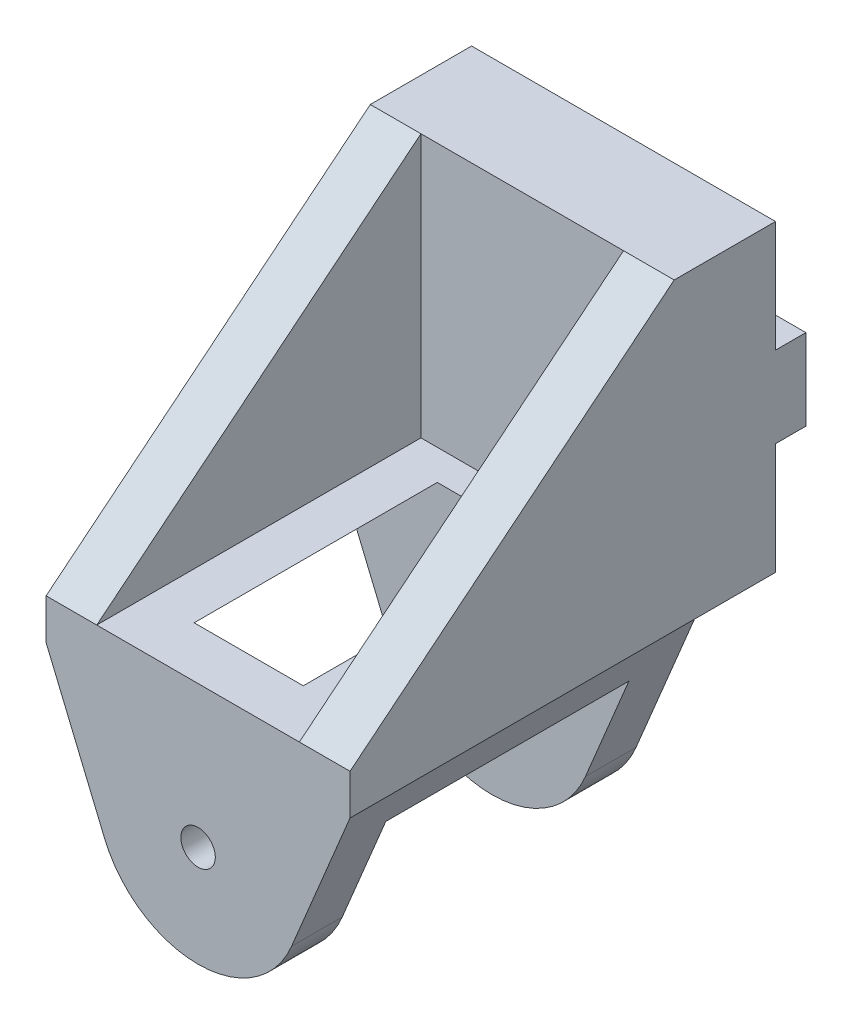
ISO-10303-21;
HEADER;
FILE_DESCRIPTION(('STEP AP214'),'2;1');
FILE_NAME('part.step','',(''),(''),'','','');
FILE_SCHEMA(('AUTOMOTIVE_DESIGN { 1 0 10303 214 1 1 1 1 }'));
ENDSEC;
DATA;
#1=APPLICATION_CONTEXT('core data for automotive mechanical design processes');
#2=APPLICATION_PROTOCOL_DEFINITION('international standard','automotive_design',2000,#1);
#3=PRODUCT_CONTEXT('',#1,'mechanical');
#4=PRODUCT('Part','Part','',(#3));
#5=PRODUCT_RELATED_PRODUCT_CATEGORY('part','',(#4));
#6=PRODUCT_DEFINITION_FORMATION('','',#4);
#7=PRODUCT_DEFINITION_CONTEXT('part definition',#1,'design');
#8=PRODUCT_DEFINITION('design','',#6,#7);
#9=PRODUCT_DEFINITION_SHAPE('','',#8);
#10=(LENGTH_UNIT() NAMED_UNIT(*) SI_UNIT(.MILLI.,.METRE.));
#11=(NAMED_UNIT(*) PLANE_ANGLE_UNIT() SI_UNIT($,.RADIAN.));
#12=(NAMED_UNIT(*) SI_UNIT($,.STERADIAN.) SOLID_ANGLE_UNIT());
#13=UNCERTAINTY_MEASURE_WITH_UNIT(LENGTH_MEASURE(1.E-05),#10,'distance_accuracy_value','');
#14=(GEOMETRIC_REPRESENTATION_CONTEXT(3) GLOBAL_UNCERTAINTY_ASSIGNED_CONTEXT((#13)) GLOBAL_UNIT_ASSIGNED_CONTEXT((#10,
#11,#12)) REPRESENTATION_CONTEXT('',''));
#15=CARTESIAN_POINT('',(0.,0.,0.));
#16=DIRECTION('',(0.,0.,1.));
#17=DIRECTION('',(1.,0.,0.));
#18=AXIS2_PLACEMENT_3D('',#15,#16,#17);
#19=CARTESIAN_POINT('',(15.,-10.,37.));
#20=DIRECTION('',(0.,0.,-1.));
#21=DIRECTION('',(-1.,0.,0.));
#22=AXIS2_PLACEMENT_3D('',#19,#20,#21);
#23=CYLINDRICAL_SURFACE('',#22,15.);
#24=CARTESIAN_POINT('',(15.,-10.,13.));
#25=DIRECTION('',(0.,0.,-1.));
#26=DIRECTION('',(-1.,0.,0.));
#27=AXIS2_PLACEMENT_3D('',#24,#25,#26);
#28=CIRCLE('',#27,15.);
#29=CARTESIAN_POINT('',(1.46910004326963,-3.52584010384713,13.));
#30=VERTEX_POINT('',#29);
#31=CARTESIAN_POINT('',(9.61483519286552,4.,13.));
#32=VERTEX_POINT('',#31);
#33=EDGE_CURVE('E312',#30,#32,#28,.T.);
#34=ORIENTED_EDGE('',*,*,#33,.T.);
#35=DIRECTION('',(0.,0.,-1.));
#36=VECTOR('',#35,1.);
#37=CARTESIAN_POINT('',(9.61483519286552,4.,37.));
#38=LINE('',#37,#36);
#39=CARTESIAN_POINT('',(9.61483519286552,4.,37.));
#40=VERTEX_POINT('',#39);
#41=EDGE_CURVE('E55',#32,#40,#38,.F.);
#42=ORIENTED_EDGE('',*,*,#41,.T.);
#43=CARTESIAN_POINT('',(15.,-10.,37.));
#44=DIRECTION('',(0.,0.,-1.));
#45=DIRECTION('',(-1.,0.,0.));
#46=AXIS2_PLACEMENT_3D('',#43,#44,#45);
#47=CIRCLE('',#46,15.);
#48=CARTESIAN_POINT('',(1.46910004326963,-3.52584010384713,37.));
#49=VERTEX_POINT('',#48);
#50=EDGE_CURVE('E304',#49,#40,#47,.T.);
#51=ORIENTED_EDGE('',*,*,#50,.F.);
#52=DIRECTION('',(0.,0.,-1.));
#53=VECTOR('',#52,1.);
#54=CARTESIAN_POINT('',(1.46910004326964,-3.52584010384713,37.));
#55=LINE('',#54,#53);
#56=EDGE_CURVE('E316',#30,#49,#55,.F.);
#57=ORIENTED_EDGE('',*,*,#56,.F.);
#58=EDGE_LOOP('',(#34,#42,#51,#57));
#59=FACE_BOUND('',#58,.T.);
#60=ADVANCED_FACE('F40',(#59),#23,.F.);
#61=CARTESIAN_POINT('',(15.,-10.,42.));
#62=DIRECTION('',(0.,0.,1.));
#63=DIRECTION('',(1.,0.,0.));
#64=AXIS2_PLACEMENT_3D('',#61,#62,#63);
#65=PLANE('',#64);
#66=DIRECTION('',(1.,0.,0.));
#67=VECTOR('',#66,1.);
#68=CARTESIAN_POINT('',(0.,4.,42.));
#69=LINE('',#68,#67);
#70=CARTESIAN_POINT('',(0.,4.,42.));
#71=VERTEX_POINT('',#70);
#72=CARTESIAN_POINT('',(5.,4.,42.));
#73=VERTEX_POINT('',#72);
#74=EDGE_CURVE('E209',#71,#73,#69,.T.);
#75=ORIENTED_EDGE('',*,*,#74,.F.);
#76=DIRECTION('',(0.,-1.,0.));
#77=VECTOR('',#76,1.);
#78=CARTESIAN_POINT('',(0.,0.,42.));
#79=LINE('',#78,#77);
#80=CARTESIAN_POINT('',(0.,0.,42.));
#81=VERTEX_POINT('',#80);
#82=EDGE_CURVE('E222',#71,#81,#79,.T.);
#83=ORIENTED_EDGE('',*,*,#82,.T.);
#84=DIRECTION('',(0.384615384615384,-0.923076923076923,0.));
#85=VECTOR('',#84,1.);
#86=CARTESIAN_POINT('',(0.,0.,42.));
#87=LINE('',#86,#85);
#88=CARTESIAN_POINT('',(5.76923076923077,-13.8461538461538,42.));
#89=VERTEX_POINT('',#88);
#90=EDGE_CURVE('E234',#81,#89,#87,.T.);
#91=ORIENTED_EDGE('',*,*,#90,.T.);
#92=CARTESIAN_POINT('',(15.,-10.,42.));
#93=DIRECTION('',(0.,0.,1.));
#94=DIRECTION('',(1.,0.,0.));
#95=AXIS2_PLACEMENT_3D('',#92,#93,#94);
#96=CIRCLE('',#95,10.);
#97=CARTESIAN_POINT('',(24.2307692307692,-13.8461538461539,42.));
#98=VERTEX_POINT('',#97);
#99=EDGE_CURVE('E237',#89,#98,#96,.T.);
#100=ORIENTED_EDGE('',*,*,#99,.T.);
#101=DIRECTION('',(0.384615384615384,0.923076923076923,0.));
#102=VECTOR('',#101,1.);
#103=CARTESIAN_POINT('',(30.,0.,42.));
#104=LINE('',#103,#102);
#105=CARTESIAN_POINT('',(30.,0.,42.));
#106=VERTEX_POINT('',#105);
#107=EDGE_CURVE('E245',#98,#106,#104,.T.);
#108=ORIENTED_EDGE('',*,*,#107,.T.);
#109=DIRECTION('',(0.,1.,0.));
#110=VECTOR('',#109,1.);
#111=CARTESIAN_POINT('',(30.,0.,42.));
#112=LINE('',#111,#110);
#113=CARTESIAN_POINT('',(30.,4.,42.));
#114=VERTEX_POINT('',#113);
#115=EDGE_CURVE('E235',#106,#114,#112,.T.);
#116=ORIENTED_EDGE('',*,*,#115,.T.);
#117=CARTESIAN_POINT('',(25.,4.,42.));
#118=VERTEX_POINT('',#117);
#119=EDGE_CURVE('E215',#118,#114,#69,.T.);
#120=ORIENTED_EDGE('',*,*,#119,.F.);
#121=DIRECTION('',(1.,0.,0.));
#122=VECTOR('',#121,1.);
#123=CARTESIAN_POINT('',(5.,4.,42.));
#124=LINE('',#123,#122);
#125=EDGE_CURVE('E226',#73,#118,#124,.T.);
#126=ORIENTED_EDGE('',*,*,#125,.F.);
#127=EDGE_LOOP('',(#75,#83,#91,#100,#108,#116,#120,#126));
#128=FACE_BOUND('',#127,.T.);
#129=CARTESIAN_POINT('',(15.,-10.,42.));
#130=DIRECTION('',(0.,0.,-1.));
#131=DIRECTION('',(-1.,0.,0.));
#132=AXIS2_PLACEMENT_3D('',#129,#130,#131);
#133=CIRCLE('',#132,1.7);
#134=CARTESIAN_POINT('',(13.3,-10.,42.));
#135=VERTEX_POINT('',#134);
#136=EDGE_CURVE('E371',#135,#135,#133,.T.);
#137=ORIENTED_EDGE('',*,*,#136,.T.);
#138=EDGE_LOOP('',(#137));
#139=FACE_BOUND('',#138,.T.);
#140=ADVANCED_FACE('F220',(#128,#139),#65,.T.);
#141=CARTESIAN_POINT('',(15.,-10.,0.));
#142=DIRECTION('',(0.,0.,1.));
#143=DIRECTION('',(1.,0.,0.));
#144=AXIS2_PLACEMENT_3D('',#141,#142,#143);
#145=PLANE('',#144);
#146=DIRECTION('',(1.,0.,0.));
#147=VECTOR('',#146,1.);
#148=CARTESIAN_POINT('',(0.,19.,0.));
#149=LINE('',#148,#147);
#150=CARTESIAN_POINT('',(0.,19.,0.));
#151=VERTEX_POINT('',#150);
#152=CARTESIAN_POINT('',(5.,19.,0.));
#153=VERTEX_POINT('',#152);
#154=EDGE_CURVE('E383',#151,#153,#149,.T.);
#155=ORIENTED_EDGE('',*,*,#154,.F.);
#156=DIRECTION('',(0.,-1.,0.));
#157=VECTOR('',#156,1.);
#158=CARTESIAN_POINT('',(0.,0.,0.));
#159=LINE('',#158,#157);
#160=CARTESIAN_POINT('',(0.,30.,0.));
#161=VERTEX_POINT('',#160);
#162=EDGE_CURVE('E240',#161,#151,#159,.T.);
#163=ORIENTED_EDGE('',*,*,#162,.F.);
#164=DIRECTION('',(-1.,0.,0.));
#165=VECTOR('',#164,1.);
#166=CARTESIAN_POINT('',(0.,30.,0.));
#167=LINE('',#166,#165);
#168=CARTESIAN_POINT('',(30.,30.,0.));
#169=VERTEX_POINT('',#168);
#170=EDGE_CURVE('E251',#169,#161,#167,.T.);
#171=ORIENTED_EDGE('',*,*,#170,.F.);
#172=DIRECTION('',(0.,1.,0.));
#173=VECTOR('',#172,1.);
#174=CARTESIAN_POINT('',(30.,0.,0.));
#175=LINE('',#174,#173);
#176=CARTESIAN_POINT('',(30.,19.,0.));
#177=VERTEX_POINT('',#176);
#178=EDGE_CURVE('E252',#177,#169,#175,.T.);
#179=ORIENTED_EDGE('',*,*,#178,.F.);
#180=DIRECTION('',(1.,0.,0.));
#181=VECTOR('',#180,1.);
#182=CARTESIAN_POINT('',(30.,19.,0.));
#183=LINE('',#182,#181);
#184=CARTESIAN_POINT('',(25.,19.,0.));
#185=VERTEX_POINT('',#184);
#186=EDGE_CURVE('E412',#185,#177,#183,.T.);
#187=ORIENTED_EDGE('',*,*,#186,.F.);
#188=DIRECTION('',(0.,1.,0.));
#189=VECTOR('',#188,1.);
#190=CARTESIAN_POINT('',(25.,19.,0.));
#191=LINE('',#190,#189);
#192=CARTESIAN_POINT('',(25.,11.,0.));
#193=VERTEX_POINT('',#192);
#194=EDGE_CURVE('E420',#193,#185,#191,.T.);
#195=ORIENTED_EDGE('',*,*,#194,.F.);
#196=DIRECTION('',(-1.,0.,0.));
#197=VECTOR('',#196,1.);
#198=CARTESIAN_POINT('',(30.,11.,0.));
#199=LINE('',#198,#197);
#200=CARTESIAN_POINT('',(30.,11.,0.));
#201=VERTEX_POINT('',#200);
#202=EDGE_CURVE('E407',#201,#193,#199,.T.);
#203=ORIENTED_EDGE('',*,*,#202,.F.);
#204=CARTESIAN_POINT('',(30.,0.,0.));
#205=VERTEX_POINT('',#204);
#206=EDGE_CURVE('E248',#205,#201,#175,.T.);
#207=ORIENTED_EDGE('',*,*,#206,.F.);
#208=DIRECTION('',(1.,0.,0.));
#209=VECTOR('',#208,1.);
#210=CARTESIAN_POINT('',(30.,0.,0.));
#211=LINE('',#210,#209);
#212=CARTESIAN_POINT('',(0.,0.,0.));
#213=VERTEX_POINT('',#212);
#214=EDGE_CURVE('E434',#213,#205,#211,.T.);
#215=ORIENTED_EDGE('',*,*,#214,.F.);
#216=CARTESIAN_POINT('',(0.,11.,0.));
#217=VERTEX_POINT('',#216);
#218=EDGE_CURVE('E255',#217,#213,#159,.T.);
#219=ORIENTED_EDGE('',*,*,#218,.F.);
#220=DIRECTION('',(-1.,0.,0.));
#221=VECTOR('',#220,1.);
#222=CARTESIAN_POINT('',(0.,11.,0.));
#223=LINE('',#222,#221);
#224=CARTESIAN_POINT('',(5.,11.,0.));
#225=VERTEX_POINT('',#224);
#226=EDGE_CURVE('E388',#225,#217,#223,.T.);
#227=ORIENTED_EDGE('',*,*,#226,.F.);
#228=DIRECTION('',(0.,-1.,0.));
#229=VECTOR('',#228,1.);
#230=CARTESIAN_POINT('',(5.,19.,0.));
#231=LINE('',#230,#229);
#232=EDGE_CURVE('E395',#153,#225,#231,.T.);
#233=ORIENTED_EDGE('',*,*,#232,.F.);
#234=EDGE_LOOP('',(#155,#163,#171,#179,#187,#195,#203,#207,#215,#219,#227,#233));
#235=FACE_BOUND('',#234,.T.);
#236=ADVANCED_FACE('F332',(#235),#145,.F.);
#237=CARTESIAN_POINT('',(0.,0.,42.));
#238=DIRECTION('',(0.923076923076923,0.384615384615384,0.));
#239=DIRECTION('',(-0.384615384615384,0.923076923076923,0.));
#240=AXIS2_PLACEMENT_3D('',#237,#238,#239);
#241=PLANE('',#240);
#242=DIRECTION('',(-0.384615384615384,0.923076923076923,0.));
#243=VECTOR('',#242,1.);
#244=CARTESIAN_POINT('',(0.,0.,8.));
#245=LINE('',#244,#243);
#246=CARTESIAN_POINT('',(5.76923076923077,-13.8461538461538,8.));
#247=VERTEX_POINT('',#246);
#248=CARTESIAN_POINT('',(0.,0.,8.));
#249=VERTEX_POINT('',#248);
#250=EDGE_CURVE('E284',#247,#249,#245,.T.);
#251=ORIENTED_EDGE('',*,*,#250,.F.);
#252=DIRECTION('',(0.,0.,-1.));
#253=VECTOR('',#252,1.);
#254=CARTESIAN_POINT('',(5.76923076923077,-13.8461538461538,42.));
#255=LINE('',#254,#253);
#256=CARTESIAN_POINT('',(5.76923076923077,-13.8461538461538,13.));
#257=VERTEX_POINT('',#256);
#258=EDGE_CURVE('E264',#257,#247,#255,.T.);
#259=ORIENTED_EDGE('',*,*,#258,.F.);
#260=DIRECTION('',(-0.384615384615384,0.923076923076923,0.));
#261=VECTOR('',#260,1.);
#262=CARTESIAN_POINT('',(0.,0.,13.));
#263=LINE('',#262,#261);
#264=EDGE_CURVE('E303',#257,#30,#263,.T.);
#265=ORIENTED_EDGE('',*,*,#264,.T.);
#266=ORIENTED_EDGE('',*,*,#56,.T.);
#267=DIRECTION('',(-0.384615384615384,0.923076923076923,0.));
#268=VECTOR('',#267,1.);
#269=CARTESIAN_POINT('',(0.,0.,37.));
#270=LINE('',#269,#268);
#271=CARTESIAN_POINT('',(5.76923076923077,-13.8461538461538,37.));
#272=VERTEX_POINT('',#271);
#273=EDGE_CURVE('E315',#272,#49,#270,.T.);
#274=ORIENTED_EDGE('',*,*,#273,.F.);
#275=EDGE_CURVE('E265',#89,#272,#255,.T.);
#276=ORIENTED_EDGE('',*,*,#275,.F.);
#277=ORIENTED_EDGE('',*,*,#90,.F.);
#278=DIRECTION('',(0.,0.,-1.));
#279=VECTOR('',#278,1.);
#280=CARTESIAN_POINT('',(0.,0.,42.));
#281=LINE('',#280,#279);
#282=EDGE_CURVE('E232',#81,#249,#281,.T.);
#283=ORIENTED_EDGE('',*,*,#282,.T.);
#284=EDGE_LOOP('',(#251,#259,#265,#266,#274,#276,#277,#283));
#285=FACE_BOUND('',#284,.T.);
#286=ADVANCED_FACE('F294',(#285),#241,.F.);
#287=CARTESIAN_POINT('',(30.,0.,42.));
#288=DIRECTION('',(-0.923076923076923,0.384615384615384,0.));
#289=DIRECTION('',(-0.384615384615384,-0.923076923076923,0.));
#290=AXIS2_PLACEMENT_3D('',#287,#288,#289);
#291=PLANE('',#290);
#292=DIRECTION('',(-0.384615384615384,-0.923076923076923,0.));
#293=VECTOR('',#292,1.);
#294=CARTESIAN_POINT('',(30.,0.,8.));
#295=LINE('',#294,#293);
#296=CARTESIAN_POINT('',(30.,0.,8.));
#297=VERTEX_POINT('',#296);
#298=CARTESIAN_POINT('',(24.2307692307692,-13.8461538461539,8.));
#299=VERTEX_POINT('',#298);
#300=EDGE_CURVE('E287',#297,#299,#295,.T.);
#301=ORIENTED_EDGE('',*,*,#300,.F.);
#302=DIRECTION('',(0.,0.,-1.));
#303=VECTOR('',#302,1.);
#304=CARTESIAN_POINT('',(30.,0.,42.));
#305=LINE('',#304,#303);
#306=EDGE_CURVE('E247',#106,#297,#305,.T.);
#307=ORIENTED_EDGE('',*,*,#306,.F.);
#308=ORIENTED_EDGE('',*,*,#107,.F.);
#309=DIRECTION('',(0.,0.,-1.));
#310=VECTOR('',#309,1.);
#311=CARTESIAN_POINT('',(24.2307692307692,-13.8461538461539,42.));
#312=LINE('',#311,#310);
#313=CARTESIAN_POINT('',(24.2307692307692,-13.8461538461539,37.));
#314=VERTEX_POINT('',#313);
#315=EDGE_CURVE('E261',#98,#314,#312,.T.);
#316=ORIENTED_EDGE('',*,*,#315,.T.);
#317=DIRECTION('',(-0.384615384615384,-0.923076923076923,0.));
#318=VECTOR('',#317,1.);
#319=CARTESIAN_POINT('',(30.,0.,37.));
#320=LINE('',#319,#318);
#321=CARTESIAN_POINT('',(28.5308999567304,-3.52584010384713,37.));
#322=VERTEX_POINT('',#321);
#323=EDGE_CURVE('E279',#322,#314,#320,.T.);
#324=ORIENTED_EDGE('',*,*,#323,.F.);
#325=DIRECTION('',(0.,0.,-1.));
#326=VECTOR('',#325,1.);
#327=CARTESIAN_POINT('',(28.5308999567304,-3.52584010384713,37.));
#328=LINE('',#327,#326);
#329=CARTESIAN_POINT('',(28.5308999567304,-3.52584010384713,13.));
#330=VERTEX_POINT('',#329);
#331=EDGE_CURVE('E276',#322,#330,#328,.T.);
#332=ORIENTED_EDGE('',*,*,#331,.T.);
#333=DIRECTION('',(-0.384615384615384,-0.923076923076923,0.));
#334=VECTOR('',#333,1.);
#335=CARTESIAN_POINT('',(30.,0.,13.));
#336=LINE('',#335,#334);
#337=CARTESIAN_POINT('',(24.2307692307692,-13.8461538461539,13.));
#338=VERTEX_POINT('',#337);
#339=EDGE_CURVE('E273',#330,#338,#336,.T.);
#340=ORIENTED_EDGE('',*,*,#339,.T.);
#341=EDGE_CURVE('E260',#338,#299,#312,.T.);
#342=ORIENTED_EDGE('',*,*,#341,.T.);
#343=EDGE_LOOP('',(#301,#307,#308,#316,#324,#332,#340,#342));
#344=FACE_BOUND('',#343,.T.);
#345=ADVANCED_FACE('F500',(#344),#291,.F.);
#346=CARTESIAN_POINT('',(15.,-10.,42.));
#347=DIRECTION('',(0.,0.,-1.));
#348=DIRECTION('',(-1.,0.,0.));
#349=AXIS2_PLACEMENT_3D('',#346,#347,#348);
#350=CYLINDRICAL_SURFACE('',#349,10.);
#351=CARTESIAN_POINT('',(15.,-10.,8.));
#352=DIRECTION('',(0.,0.,-1.));
#353=DIRECTION('',(-1.,0.,0.));
#354=AXIS2_PLACEMENT_3D('',#351,#352,#353);
#355=CIRCLE('',#354,10.);
#356=EDGE_CURVE('E48',#299,#247,#355,.T.);
#357=ORIENTED_EDGE('',*,*,#356,.F.);
#358=ORIENTED_EDGE('',*,*,#341,.F.);
#359=CARTESIAN_POINT('',(15.,-10.,13.));
#360=DIRECTION('',(0.,0.,-1.));
#361=DIRECTION('',(-1.,0.,0.));
#362=AXIS2_PLACEMENT_3D('',#359,#360,#361);
#363=CIRCLE('',#362,10.);
#364=EDGE_CURVE('E300',#338,#257,#363,.T.);
#365=ORIENTED_EDGE('',*,*,#364,.T.);
#366=ORIENTED_EDGE('',*,*,#258,.T.);
#367=EDGE_LOOP('',(#357,#358,#365,#366));
#368=FACE_BOUND('',#367,.T.);
#369=ADVANCED_FACE('F299',(#368),#350,.T.);
#370=CARTESIAN_POINT('',(15.,-10.,37.));
#371=DIRECTION('',(0.,0.,-1.));
#372=DIRECTION('',(-1.,0.,0.));
#373=AXIS2_PLACEMENT_3D('',#370,#371,#372);
#374=CIRCLE('',#373,10.);
#375=EDGE_CURVE('E306',#314,#272,#374,.T.);
#376=ORIENTED_EDGE('',*,*,#375,.F.);
#377=ORIENTED_EDGE('',*,*,#315,.F.);
#378=ORIENTED_EDGE('',*,*,#99,.F.);
#379=ORIENTED_EDGE('',*,*,#275,.T.);
#380=EDGE_LOOP('',(#376,#377,#378,#379));
#381=FACE_BOUND('',#380,.T.);
#382=ADVANCED_FACE('F506',(#381),#350,.T.);
#383=CARTESIAN_POINT('',(30.,0.,42.));
#384=DIRECTION('',(-1.,0.,0.));
#385=DIRECTION('',(0.,0.,1.));
#386=AXIS2_PLACEMENT_3D('',#383,#384,#385);
#387=PLANE('',#386);
#388=DIRECTION('',(0.,0.,-1.));
#389=VECTOR('',#388,1.);
#390=CARTESIAN_POINT('',(30.,30.,42.));
#391=LINE('',#390,#389);
#392=CARTESIAN_POINT('',(30.,30.,10.));
#393=VERTEX_POINT('',#392);
#394=EDGE_CURVE('E271',#393,#169,#391,.T.);
#395=ORIENTED_EDGE('',*,*,#394,.F.);
#396=DIRECTION('',(0.,0.630592625094466,-0.776114000116266));
#397=VECTOR('',#396,1.);
#398=CARTESIAN_POINT('',(30.,30.,10.));
#399=LINE('',#398,#397);
#400=EDGE_CURVE('E216',#114,#393,#399,.T.);
#401=ORIENTED_EDGE('',*,*,#400,.F.);
#402=ORIENTED_EDGE('',*,*,#115,.F.);
#403=ORIENTED_EDGE('',*,*,#306,.T.);
#404=DIRECTION('',(0.,0.,-1.));
#405=VECTOR('',#404,1.);
#406=CARTESIAN_POINT('',(30.,0.,49.0555127546399));
#407=LINE('',#406,#405);
#408=EDGE_CURVE('E437',#297,#205,#407,.T.);
#409=ORIENTED_EDGE('',*,*,#408,.T.);
#410=ORIENTED_EDGE('',*,*,#206,.T.);
#411=DIRECTION('',(0.,0.,1.));
#412=VECTOR('',#411,1.);
#413=CARTESIAN_POINT('',(30.,11.,-3.));
#414=LINE('',#413,#412);
#415=CARTESIAN_POINT('',(30.,11.,-3.));
#416=VERTEX_POINT('',#415);
#417=EDGE_CURVE('E431',#416,#201,#414,.T.);
#418=ORIENTED_EDGE('',*,*,#417,.F.);
#419=DIRECTION('',(0.,-1.,0.));
#420=VECTOR('',#419,1.);
#421=CARTESIAN_POINT('',(30.,19.,-3.));
#422=LINE('',#421,#420);
#423=CARTESIAN_POINT('',(30.,19.,-3.));
#424=VERTEX_POINT('',#423);
#425=EDGE_CURVE('E408',#424,#416,#422,.T.);
#426=ORIENTED_EDGE('',*,*,#425,.F.);
#427=DIRECTION('',(0.,0.,1.));
#428=VECTOR('',#427,1.);
#429=CARTESIAN_POINT('',(30.,19.,-3.));
#430=LINE('',#429,#428);
#431=EDGE_CURVE('E327',#424,#177,#430,.T.);
#432=ORIENTED_EDGE('',*,*,#431,.T.);
#433=ORIENTED_EDGE('',*,*,#178,.T.);
#434=EDGE_LOOP('',(#395,#401,#402,#403,#409,#410,#418,#426,#432,#433));
#435=FACE_BOUND('',#434,.T.);
#436=ADVANCED_FACE('F42',(#435),#387,.F.);
#437=CARTESIAN_POINT('',(0.,30.,42.));
#438=DIRECTION('',(0.,-1.,0.));
#439=DIRECTION('',(0.,0.,-1.));
#440=AXIS2_PLACEMENT_3D('',#437,#438,#439);
#441=PLANE('',#440);
#442=DIRECTION('',(0.,0.,-1.));
#443=VECTOR('',#442,1.);
#444=CARTESIAN_POINT('',(0.,30.,42.));
#445=LINE('',#444,#443);
#446=CARTESIAN_POINT('',(0.,30.,10.));
#447=VERTEX_POINT('',#446);
#448=EDGE_CURVE('E269',#447,#161,#445,.T.);
#449=ORIENTED_EDGE('',*,*,#448,.F.);
#450=DIRECTION('',(1.,0.,0.));
#451=VECTOR('',#450,1.);
#452=CARTESIAN_POINT('',(0.,30.,10.));
#453=LINE('',#452,#451);
#454=CARTESIAN_POINT('',(5.,30.,10.));
#455=VERTEX_POINT('',#454);
#456=EDGE_CURVE('E212',#447,#455,#453,.T.);
#457=ORIENTED_EDGE('',*,*,#456,.T.);
#458=DIRECTION('',(-1.,0.,0.));
#459=VECTOR('',#458,1.);
#460=CARTESIAN_POINT('',(5.,30.,10.));
#461=LINE('',#460,#459);
#462=CARTESIAN_POINT('',(25.,30.,10.));
#463=VERTEX_POINT('',#462);
#464=EDGE_CURVE('E338',#463,#455,#461,.T.);
#465=ORIENTED_EDGE('',*,*,#464,.F.);
#466=EDGE_CURVE('E227',#463,#393,#453,.T.);
#467=ORIENTED_EDGE('',*,*,#466,.T.);
#468=ORIENTED_EDGE('',*,*,#394,.T.);
#469=ORIENTED_EDGE('',*,*,#170,.T.);
#470=EDGE_LOOP('',(#449,#457,#465,#467,#468,#469));
#471=FACE_BOUND('',#470,.T.);
#472=ADVANCED_FACE('F334',(#471),#441,.F.);
#473=CARTESIAN_POINT('',(0.,0.,42.));
#474=DIRECTION('',(1.,0.,0.));
#475=DIRECTION('',(0.,0.,-1.));
#476=AXIS2_PLACEMENT_3D('',#473,#474,#475);
#477=PLANE('',#476);
#478=ORIENTED_EDGE('',*,*,#82,.F.);
#479=DIRECTION('',(0.,0.630592625094466,-0.776114000116266));
#480=VECTOR('',#479,1.);
#481=CARTESIAN_POINT('',(0.,30.,10.));
#482=LINE('',#481,#480);
#483=EDGE_CURVE('E206',#71,#447,#482,.T.);
#484=ORIENTED_EDGE('',*,*,#483,.T.);
#485=ORIENTED_EDGE('',*,*,#448,.T.);
#486=ORIENTED_EDGE('',*,*,#162,.T.);
#487=DIRECTION('',(0.,0.,1.));
#488=VECTOR('',#487,1.);
#489=CARTESIAN_POINT('',(0.,19.,-3.));
#490=LINE('',#489,#488);
#491=CARTESIAN_POINT('',(0.,19.,-3.));
#492=VERTEX_POINT('',#491);
#493=EDGE_CURVE('E405',#492,#151,#490,.T.);
#494=ORIENTED_EDGE('',*,*,#493,.F.);
#495=DIRECTION('',(0.,1.,0.));
#496=VECTOR('',#495,1.);
#497=CARTESIAN_POINT('',(0.,19.,-3.));
#498=LINE('',#497,#496);
#499=CARTESIAN_POINT('',(0.,11.,-3.));
#500=VERTEX_POINT('',#499);
#501=EDGE_CURVE('E384',#500,#492,#498,.T.);
#502=ORIENTED_EDGE('',*,*,#501,.F.);
#503=DIRECTION('',(0.,0.,1.));
#504=VECTOR('',#503,1.);
#505=CARTESIAN_POINT('',(0.,11.,-3.));
#506=LINE('',#505,#504);
#507=EDGE_CURVE('E62',#500,#217,#506,.T.);
#508=ORIENTED_EDGE('',*,*,#507,.T.);
#509=ORIENTED_EDGE('',*,*,#218,.T.);
#510=DIRECTION('',(0.,0.,-1.));
#511=VECTOR('',#510,1.);
#512=CARTESIAN_POINT('',(0.,0.,49.0555127546399));
#513=LINE('',#512,#511);
#514=EDGE_CURVE('E439',#249,#213,#513,.T.);
#515=ORIENTED_EDGE('',*,*,#514,.F.);
#516=ORIENTED_EDGE('',*,*,#282,.F.);
#517=EDGE_LOOP('',(#478,#484,#485,#486,#494,#502,#508,#509,#515,#516));
#518=FACE_BOUND('',#517,.T.);
#519=ADVANCED_FACE('F229',(#518),#477,.F.);
#520=CARTESIAN_POINT('',(20.3851648071345,4.,37.));
#521=VERTEX_POINT('',#520);
#522=EDGE_CURVE('E309',#521,#322,#47,.T.);
#523=ORIENTED_EDGE('',*,*,#522,.F.);
#524=DIRECTION('',(0.,0.,-1.));
#525=VECTOR('',#524,1.);
#526=CARTESIAN_POINT('',(20.3851648071345,4.,37.));
#527=LINE('',#526,#525);
#528=CARTESIAN_POINT('',(20.3851648071345,4.,13.));
#529=VERTEX_POINT('',#528);
#530=EDGE_CURVE('E363',#521,#529,#527,.T.);
#531=ORIENTED_EDGE('',*,*,#530,.T.);
#532=EDGE_CURVE('E296',#529,#330,#28,.T.);
#533=ORIENTED_EDGE('',*,*,#532,.T.);
#534=ORIENTED_EDGE('',*,*,#331,.F.);
#535=EDGE_LOOP('',(#523,#531,#533,#534));
#536=FACE_BOUND('',#535,.T.);
#537=ADVANCED_FACE('F475',(#536),#23,.F.);
#538=CARTESIAN_POINT('',(15.,-10.,37.));
#539=DIRECTION('',(0.,0.,-1.));
#540=DIRECTION('',(-1.,0.,0.));
#541=AXIS2_PLACEMENT_3D('',#538,#539,#540);
#542=PLANE('',#541);
#543=DIRECTION('',(-1.,0.,0.));
#544=VECTOR('',#543,1.);
#545=CARTESIAN_POINT('',(15.,4.,37.));
#546=LINE('',#545,#544);
#547=EDGE_CURVE('E369',#521,#40,#546,.T.);
#548=ORIENTED_EDGE('',*,*,#547,.F.);
#549=ORIENTED_EDGE('',*,*,#522,.T.);
#550=ORIENTED_EDGE('',*,*,#323,.T.);
#551=ORIENTED_EDGE('',*,*,#375,.T.);
#552=ORIENTED_EDGE('',*,*,#273,.T.);
#553=ORIENTED_EDGE('',*,*,#50,.T.);
#554=EDGE_LOOP('',(#548,#549,#550,#551,#552,#553));
#555=FACE_BOUND('',#554,.T.);
#556=CARTESIAN_POINT('',(15.,-10.,37.));
#557=DIRECTION('',(0.,0.,-1.));
#558=DIRECTION('',(-1.,0.,0.));
#559=AXIS2_PLACEMENT_3D('',#556,#557,#558);
#560=CIRCLE('',#559,1.7);
#561=CARTESIAN_POINT('',(13.3,-10.,37.));
#562=VERTEX_POINT('',#561);
#563=EDGE_CURVE('E380',#562,#562,#560,.T.);
#564=ORIENTED_EDGE('',*,*,#563,.F.);
#565=EDGE_LOOP('',(#564));
#566=FACE_BOUND('',#565,.T.);
#567=ADVANCED_FACE('F483',(#555,#566),#542,.T.);
#568=CARTESIAN_POINT('',(15.,-10.,13.));
#569=DIRECTION('',(0.,0.,-1.));
#570=DIRECTION('',(-1.,0.,0.));
#571=AXIS2_PLACEMENT_3D('',#568,#569,#570);
#572=PLANE('',#571);
#573=CARTESIAN_POINT('',(15.,-10.,13.));
#574=DIRECTION('',(0.,0.,-1.));
#575=DIRECTION('',(-1.,0.,0.));
#576=AXIS2_PLACEMENT_3D('',#573,#574,#575);
#577=CIRCLE('',#576,1.7);
#578=CARTESIAN_POINT('',(13.3,-10.,13.));
#579=VERTEX_POINT('',#578);
#580=EDGE_CURVE('E377',#579,#579,#577,.T.);
#581=ORIENTED_EDGE('',*,*,#580,.T.);
#582=EDGE_LOOP('',(#581));
#583=FACE_BOUND('',#582,.T.);
#584=ORIENTED_EDGE('',*,*,#532,.F.);
#585=DIRECTION('',(-1.,0.,0.));
#586=VECTOR('',#585,1.);
#587=CARTESIAN_POINT('',(15.,4.,13.));
#588=LINE('',#587,#586);
#589=EDGE_CURVE('E12',#529,#32,#588,.T.);
#590=ORIENTED_EDGE('',*,*,#589,.T.);
#591=ORIENTED_EDGE('',*,*,#33,.F.);
#592=ORIENTED_EDGE('',*,*,#264,.F.);
#593=ORIENTED_EDGE('',*,*,#364,.F.);
#594=ORIENTED_EDGE('',*,*,#339,.F.);
#595=EDGE_LOOP('',(#584,#590,#591,#592,#593,#594));
#596=FACE_BOUND('',#595,.T.);
#597=ADVANCED_FACE('F489',(#583,#596),#572,.F.);
#598=CARTESIAN_POINT('',(15.,-10.,8.));
#599=DIRECTION('',(0.,0.,-1.));
#600=DIRECTION('',(-1.,0.,0.));
#601=AXIS2_PLACEMENT_3D('',#598,#599,#600);
#602=PLANE('',#601);
#603=CARTESIAN_POINT('',(15.,-10.,8.));
#604=DIRECTION('',(0.,0.,-1.));
#605=DIRECTION('',(-1.,0.,0.));
#606=AXIS2_PLACEMENT_3D('',#603,#604,#605);
#607=CIRCLE('',#606,1.7);
#608=CARTESIAN_POINT('',(13.3,-10.,8.));
#609=VERTEX_POINT('',#608);
#610=EDGE_CURVE('E374',#609,#609,#607,.T.);
#611=ORIENTED_EDGE('',*,*,#610,.F.);
#612=EDGE_LOOP('',(#611));
#613=FACE_BOUND('',#612,.T.);
#614=ORIENTED_EDGE('',*,*,#250,.T.);
#615=DIRECTION('',(-1.,0.,0.));
#616=VECTOR('',#615,1.);
#617=CARTESIAN_POINT('',(30.,0.,8.));
#618=LINE('',#617,#616);
#619=EDGE_CURVE('E435',#297,#249,#618,.T.);
#620=ORIENTED_EDGE('',*,*,#619,.F.);
#621=ORIENTED_EDGE('',*,*,#300,.T.);
#622=ORIENTED_EDGE('',*,*,#356,.T.);
#623=EDGE_LOOP('',(#614,#620,#621,#622));
#624=FACE_BOUND('',#623,.T.);
#625=ADVANCED_FACE('F283',(#613,#624),#602,.T.);
#626=CARTESIAN_POINT('',(30.,0.,49.0555127546399));
#627=DIRECTION('',(0.,1.,0.));
#628=DIRECTION('',(0.,0.,1.));
#629=AXIS2_PLACEMENT_3D('',#626,#627,#628);
#630=PLANE('',#629);
#631=ORIENTED_EDGE('',*,*,#619,.T.);
#632=ORIENTED_EDGE('',*,*,#514,.T.);
#633=ORIENTED_EDGE('',*,*,#214,.T.);
#634=ORIENTED_EDGE('',*,*,#408,.F.);
#635=EDGE_LOOP('',(#631,#632,#633,#634));
#636=FACE_BOUND('',#635,.T.);
#637=ADVANCED_FACE('F446',(#636),#630,.F.);
#638=CARTESIAN_POINT('',(30.,11.,-3.));
#639=DIRECTION('',(0.,1.,0.));
#640=DIRECTION('',(0.,0.,1.));
#641=AXIS2_PLACEMENT_3D('',#638,#639,#640);
#642=PLANE('',#641);
#643=ORIENTED_EDGE('',*,*,#202,.T.);
#644=DIRECTION('',(0.,0.,1.));
#645=VECTOR('',#644,1.);
#646=CARTESIAN_POINT('',(25.,11.,-3.));
#647=LINE('',#646,#645);
#648=CARTESIAN_POINT('',(25.,11.,-3.));
#649=VERTEX_POINT('',#648);
#650=EDGE_CURVE('E428',#649,#193,#647,.T.);
#651=ORIENTED_EDGE('',*,*,#650,.F.);
#652=DIRECTION('',(-1.,0.,0.));
#653=VECTOR('',#652,1.);
#654=CARTESIAN_POINT('',(30.,11.,-3.));
#655=LINE('',#654,#653);
#656=EDGE_CURVE('E411',#416,#649,#655,.T.);
#657=ORIENTED_EDGE('',*,*,#656,.F.);
#658=ORIENTED_EDGE('',*,*,#417,.T.);
#659=EDGE_LOOP('',(#643,#651,#657,#658));
#660=FACE_BOUND('',#659,.T.);
#661=ADVANCED_FACE('F453',(#660),#642,.F.);
#662=CARTESIAN_POINT('',(25.,19.,-3.));
#663=DIRECTION('',(1.,0.,0.));
#664=DIRECTION('',(0.,1.,0.));
#665=AXIS2_PLACEMENT_3D('',#662,#663,#664);
#666=PLANE('',#665);
#667=ORIENTED_EDGE('',*,*,#194,.T.);
#668=DIRECTION('',(0.,0.,1.));
#669=VECTOR('',#668,1.);
#670=CARTESIAN_POINT('',(25.,19.,-3.));
#671=LINE('',#670,#669);
#672=CARTESIAN_POINT('',(25.,19.,-3.));
#673=VERTEX_POINT('',#672);
#674=EDGE_CURVE('E425',#673,#185,#671,.T.);
#675=ORIENTED_EDGE('',*,*,#674,.F.);
#676=DIRECTION('',(0.,1.,0.));
#677=VECTOR('',#676,1.);
#678=CARTESIAN_POINT('',(25.,19.,-3.));
#679=LINE('',#678,#677);
#680=EDGE_CURVE('E414',#649,#673,#679,.T.);
#681=ORIENTED_EDGE('',*,*,#680,.F.);
#682=ORIENTED_EDGE('',*,*,#650,.T.);
#683=EDGE_LOOP('',(#667,#675,#681,#682));
#684=FACE_BOUND('',#683,.T.);
#685=ADVANCED_FACE('F463',(#684),#666,.F.);
#686=CARTESIAN_POINT('',(30.,19.,-3.));
#687=DIRECTION('',(0.,-1.,0.));
#688=DIRECTION('',(1.,0.,0.));
#689=AXIS2_PLACEMENT_3D('',#686,#687,#688);
#690=PLANE('',#689);
#691=ORIENTED_EDGE('',*,*,#186,.T.);
#692=ORIENTED_EDGE('',*,*,#431,.F.);
#693=DIRECTION('',(1.,0.,0.));
#694=VECTOR('',#693,1.);
#695=CARTESIAN_POINT('',(30.,19.,-3.));
#696=LINE('',#695,#694);
#697=EDGE_CURVE('E416',#673,#424,#696,.T.);
#698=ORIENTED_EDGE('',*,*,#697,.F.);
#699=ORIENTED_EDGE('',*,*,#674,.T.);
#700=EDGE_LOOP('',(#691,#692,#698,#699));
#701=FACE_BOUND('',#700,.T.);
#702=ADVANCED_FACE('F461',(#701),#690,.F.);
#703=CARTESIAN_POINT('',(0.,0.,-3.));
#704=DIRECTION('',(0.,0.,-1.));
#705=DIRECTION('',(-1.,0.,0.));
#706=AXIS2_PLACEMENT_3D('',#703,#704,#705);
#707=PLANE('',#706);
#708=ORIENTED_EDGE('',*,*,#425,.T.);
#709=ORIENTED_EDGE('',*,*,#656,.T.);
#710=ORIENTED_EDGE('',*,*,#680,.T.);
#711=ORIENTED_EDGE('',*,*,#697,.T.);
#712=EDGE_LOOP('',(#708,#709,#710,#711));
#713=FACE_BOUND('',#712,.T.);
#714=ADVANCED_FACE('F457',(#713),#707,.T.);
#715=CARTESIAN_POINT('',(0.,19.,-3.));
#716=DIRECTION('',(0.,-1.,0.));
#717=DIRECTION('',(0.,0.,-1.));
#718=AXIS2_PLACEMENT_3D('',#715,#716,#717);
#719=PLANE('',#718);
#720=ORIENTED_EDGE('',*,*,#154,.T.);
#721=DIRECTION('',(0.,0.,1.));
#722=VECTOR('',#721,1.);
#723=CARTESIAN_POINT('',(5.,19.,-3.));
#724=LINE('',#723,#722);
#725=CARTESIAN_POINT('',(5.,19.,-3.));
#726=VERTEX_POINT('',#725);
#727=EDGE_CURVE('E402',#726,#153,#724,.T.);
#728=ORIENTED_EDGE('',*,*,#727,.F.);
#729=DIRECTION('',(1.,0.,0.));
#730=VECTOR('',#729,1.);
#731=CARTESIAN_POINT('',(0.,19.,-3.));
#732=LINE('',#731,#730);
#733=EDGE_CURVE('E387',#492,#726,#732,.T.);
#734=ORIENTED_EDGE('',*,*,#733,.F.);
#735=ORIENTED_EDGE('',*,*,#493,.T.);
#736=EDGE_LOOP('',(#720,#728,#734,#735));
#737=FACE_BOUND('',#736,.T.);
#738=ADVANCED_FACE('F554',(#737),#719,.F.);
#739=CARTESIAN_POINT('',(5.,19.,-3.));
#740=DIRECTION('',(-1.,0.,0.));
#741=DIRECTION('',(0.,-1.,0.));
#742=AXIS2_PLACEMENT_3D('',#739,#740,#741);
#743=PLANE('',#742);
#744=ORIENTED_EDGE('',*,*,#232,.T.);
#745=DIRECTION('',(0.,0.,1.));
#746=VECTOR('',#745,1.);
#747=CARTESIAN_POINT('',(5.,11.,-3.));
#748=LINE('',#747,#746);
#749=CARTESIAN_POINT('',(5.,11.,-3.));
#750=VERTEX_POINT('',#749);
#751=EDGE_CURVE('E399',#750,#225,#748,.T.);
#752=ORIENTED_EDGE('',*,*,#751,.F.);
#753=DIRECTION('',(0.,-1.,0.));
#754=VECTOR('',#753,1.);
#755=CARTESIAN_POINT('',(5.,19.,-3.));
#756=LINE('',#755,#754);
#757=EDGE_CURVE('E390',#726,#750,#756,.T.);
#758=ORIENTED_EDGE('',*,*,#757,.F.);
#759=ORIENTED_EDGE('',*,*,#727,.T.);
#760=EDGE_LOOP('',(#744,#752,#758,#759));
#761=FACE_BOUND('',#760,.T.);
#762=ADVANCED_FACE('F550',(#761),#743,.F.);
#763=CARTESIAN_POINT('',(0.,11.,-3.));
#764=DIRECTION('',(0.,1.,0.));
#765=DIRECTION('',(-1.,0.,0.));
#766=AXIS2_PLACEMENT_3D('',#763,#764,#765);
#767=PLANE('',#766);
#768=ORIENTED_EDGE('',*,*,#226,.T.);
#769=ORIENTED_EDGE('',*,*,#507,.F.);
#770=DIRECTION('',(-1.,0.,0.));
#771=VECTOR('',#770,1.);
#772=CARTESIAN_POINT('',(0.,11.,-3.));
#773=LINE('',#772,#771);
#774=EDGE_CURVE('E392',#750,#500,#773,.T.);
#775=ORIENTED_EDGE('',*,*,#774,.F.);
#776=ORIENTED_EDGE('',*,*,#751,.T.);
#777=EDGE_LOOP('',(#768,#769,#775,#776));
#778=FACE_BOUND('',#777,.T.);
#779=ADVANCED_FACE('F546',(#778),#767,.F.);
#780=CARTESIAN_POINT('',(0.,0.,-3.));
#781=DIRECTION('',(0.,0.,1.));
#782=DIRECTION('',(1.,0.,0.));
#783=AXIS2_PLACEMENT_3D('',#780,#781,#782);
#784=PLANE('',#783);
#785=ORIENTED_EDGE('',*,*,#501,.T.);
#786=ORIENTED_EDGE('',*,*,#733,.T.);
#787=ORIENTED_EDGE('',*,*,#757,.T.);
#788=ORIENTED_EDGE('',*,*,#774,.T.);
#789=EDGE_LOOP('',(#785,#786,#787,#788));
#790=FACE_BOUND('',#789,.T.);
#791=ADVANCED_FACE('F543',(#790),#784,.F.);
#792=CARTESIAN_POINT('',(15.,-10.,8.));
#793=DIRECTION('',(0.,0.,-1.));
#794=DIRECTION('',(-1.,0.,0.));
#795=AXIS2_PLACEMENT_3D('',#792,#793,#794);
#796=CYLINDRICAL_SURFACE('',#795,1.7);
#797=ORIENTED_EDGE('',*,*,#610,.T.);
#798=EDGE_LOOP('',(#797));
#799=FACE_BOUND('',#798,.T.);
#800=ORIENTED_EDGE('',*,*,#580,.F.);
#801=EDGE_LOOP('',(#800));
#802=FACE_BOUND('',#801,.T.);
#803=ADVANCED_FACE('F541',(#799,#802),#796,.F.);
#804=ORIENTED_EDGE('',*,*,#563,.T.);
#805=EDGE_LOOP('',(#804));
#806=FACE_BOUND('',#805,.T.);
#807=ORIENTED_EDGE('',*,*,#136,.F.);
#808=EDGE_LOOP('',(#807));
#809=FACE_BOUND('',#808,.T.);
#810=ADVANCED_FACE('F538',(#806,#809),#796,.F.);
#811=CARTESIAN_POINT('',(5.,4.,42.));
#812=DIRECTION('',(-1.,0.,0.));
#813=DIRECTION('',(0.,0.,1.));
#814=AXIS2_PLACEMENT_3D('',#811,#812,#813);
#815=PLANE('',#814);
#816=DIRECTION('',(0.,1.,0.));
#817=VECTOR('',#816,1.);
#818=CARTESIAN_POINT('',(5.,4.,10.));
#819=LINE('',#818,#817);
#820=CARTESIAN_POINT('',(5.,4.,10.));
#821=VERTEX_POINT('',#820);
#822=EDGE_CURVE('E360',#821,#455,#819,.T.);
#823=ORIENTED_EDGE('',*,*,#822,.T.);
#824=DIRECTION('',(0.,-0.630592625094466,0.776114000116266));
#825=VECTOR('',#824,1.);
#826=CARTESIAN_POINT('',(5.,4.,42.));
#827=LINE('',#826,#825);
#828=EDGE_CURVE('E346',#455,#73,#827,.T.);
#829=ORIENTED_EDGE('',*,*,#828,.T.);
#830=DIRECTION('',(0.,0.,1.));
#831=VECTOR('',#830,1.);
#832=CARTESIAN_POINT('',(5.,4.,42.));
#833=LINE('',#832,#831);
#834=EDGE_CURVE('E348',#821,#73,#833,.T.);
#835=ORIENTED_EDGE('',*,*,#834,.F.);
#836=EDGE_LOOP('',(#823,#829,#835));
#837=FACE_BOUND('',#836,.T.);
#838=ADVANCED_FACE('F519',(#837),#815,.F.);
#839=CARTESIAN_POINT('',(5.,4.,10.));
#840=DIRECTION('',(0.,0.,-1.));
#841=DIRECTION('',(-1.,0.,0.));
#842=AXIS2_PLACEMENT_3D('',#839,#840,#841);
#843=PLANE('',#842);
#844=ORIENTED_EDGE('',*,*,#464,.T.);
#845=ORIENTED_EDGE('',*,*,#822,.F.);
#846=DIRECTION('',(-1.,0.,0.));
#847=VECTOR('',#846,1.);
#848=CARTESIAN_POINT('',(5.,4.,10.));
#849=LINE('',#848,#847);
#850=CARTESIAN_POINT('',(25.,4.,10.));
#851=VERTEX_POINT('',#850);
#852=EDGE_CURVE('E355',#851,#821,#849,.T.);
#853=ORIENTED_EDGE('',*,*,#852,.F.);
#854=DIRECTION('',(0.,1.,0.));
#855=VECTOR('',#854,1.);
#856=CARTESIAN_POINT('',(25.,4.,10.));
#857=LINE('',#856,#855);
#858=EDGE_CURVE('E358',#851,#463,#857,.T.);
#859=ORIENTED_EDGE('',*,*,#858,.T.);
#860=EDGE_LOOP('',(#844,#845,#853,#859));
#861=FACE_BOUND('',#860,.T.);
#862=ADVANCED_FACE('F521',(#861),#843,.F.);
#863=CARTESIAN_POINT('',(25.,4.,42.));
#864=DIRECTION('',(1.,0.,0.));
#865=DIRECTION('',(0.,0.,-1.));
#866=AXIS2_PLACEMENT_3D('',#863,#864,#865);
#867=PLANE('',#866);
#868=DIRECTION('',(0.,0.,-1.));
#869=VECTOR('',#868,1.);
#870=CARTESIAN_POINT('',(25.,4.,42.));
#871=LINE('',#870,#869);
#872=EDGE_CURVE('E352',#118,#851,#871,.T.);
#873=ORIENTED_EDGE('',*,*,#872,.F.);
#874=DIRECTION('',(0.,0.630592625094466,-0.776114000116266));
#875=VECTOR('',#874,1.);
#876=CARTESIAN_POINT('',(25.,4.,42.));
#877=LINE('',#876,#875);
#878=EDGE_CURVE('E342',#118,#463,#877,.T.);
#879=ORIENTED_EDGE('',*,*,#878,.T.);
#880=ORIENTED_EDGE('',*,*,#858,.F.);
#881=EDGE_LOOP('',(#873,#879,#880));
#882=FACE_BOUND('',#881,.T.);
#883=ADVANCED_FACE('F514',(#882),#867,.F.);
#884=CARTESIAN_POINT('',(0.,4.,0.));
#885=DIRECTION('',(0.,-1.,0.));
#886=DIRECTION('',(0.,0.,-1.));
#887=AXIS2_PLACEMENT_3D('',#884,#885,#886);
#888=PLANE('',#887);
#889=ORIENTED_EDGE('',*,*,#547,.T.);
#890=ORIENTED_EDGE('',*,*,#41,.F.);
#891=ORIENTED_EDGE('',*,*,#589,.F.);
#892=ORIENTED_EDGE('',*,*,#530,.F.);
#893=EDGE_LOOP('',(#889,#890,#891,#892));
#894=FACE_BOUND('',#893,.T.);
#895=ORIENTED_EDGE('',*,*,#834,.T.);
#896=ORIENTED_EDGE('',*,*,#125,.T.);
#897=ORIENTED_EDGE('',*,*,#872,.T.);
#898=ORIENTED_EDGE('',*,*,#852,.T.);
#899=EDGE_LOOP('',(#895,#896,#897,#898));
#900=FACE_BOUND('',#899,.T.);
#901=ADVANCED_FACE('F510',(#894,#900),#888,.F.);
#902=CARTESIAN_POINT('',(0.,30.,10.));
#903=DIRECTION('',(0.,-0.776114000116266,-0.630592625094466));
#904=DIRECTION('',(0.,0.630592625094466,-0.776114000116266));
#905=AXIS2_PLACEMENT_3D('',#902,#903,#904);
#906=PLANE('',#905);
#907=ORIENTED_EDGE('',*,*,#119,.T.);
#908=ORIENTED_EDGE('',*,*,#400,.T.);
#909=ORIENTED_EDGE('',*,*,#466,.F.);
#910=ORIENTED_EDGE('',*,*,#878,.F.);
#911=EDGE_LOOP('',(#907,#908,#909,#910));
#912=FACE_BOUND('',#911,.T.);
#913=ADVANCED_FACE('F513',(#912),#906,.F.);
#914=ORIENTED_EDGE('',*,*,#456,.F.);
#915=ORIENTED_EDGE('',*,*,#483,.F.);
#916=ORIENTED_EDGE('',*,*,#74,.T.);
#917=ORIENTED_EDGE('',*,*,#828,.F.);
#918=EDGE_LOOP('',(#914,#915,#916,#917));
#919=FACE_BOUND('',#918,.T.);
#920=ADVANCED_FACE('F208',(#919),#906,.F.);
#921=CLOSED_SHELL('',(#60,#140,#236,#286,#345,#369,#382,#436,#472,#519,#537,#567,#597,#625,#637,
#661,#685,#702,#714,#738,#762,#779,#791,#803,#810,#838,#862,#883,#901,#913,#920));
#922=MANIFOLD_SOLID_BREP('B2',#921);
#923=ADVANCED_BREP_SHAPE_REPRESENTATION('',(#18,#922),#14);
#924=SHAPE_DEFINITION_REPRESENTATION(#9,#923);
ENDSEC;
END-ISO-10303-21;
